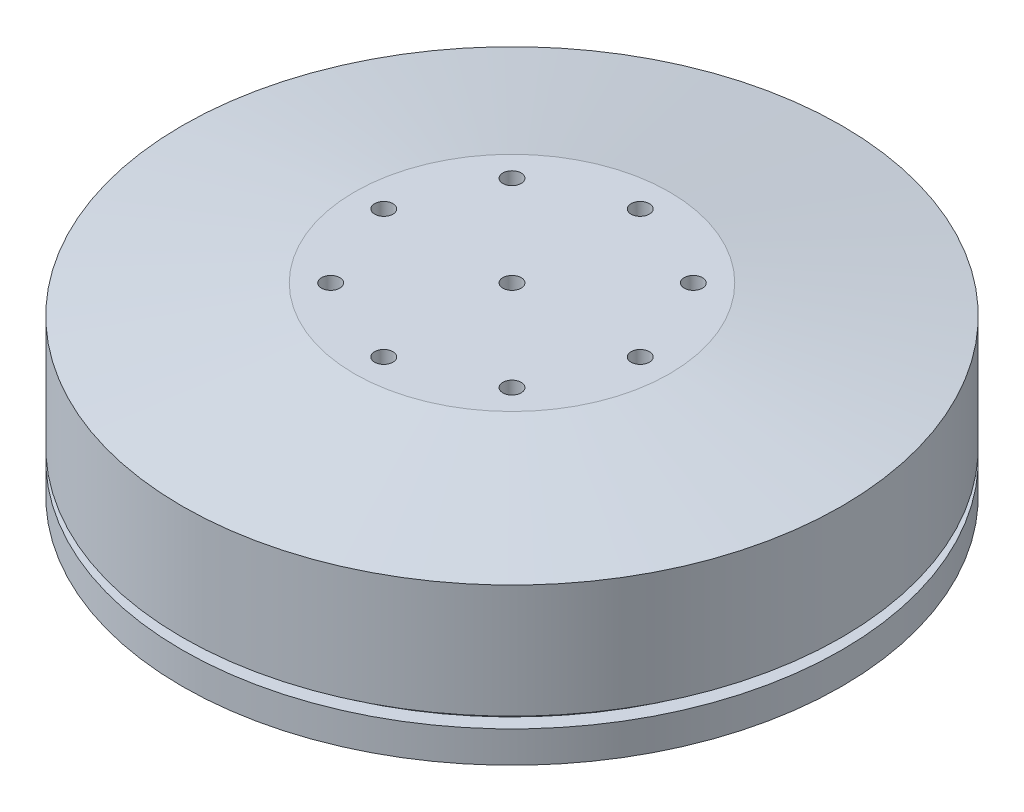
ISO-10303-21;
HEADER;
FILE_DESCRIPTION(('STEP AP214'),'2;1');
FILE_NAME('part.step','',(''),(''),'','','');
FILE_SCHEMA(('AUTOMOTIVE_DESIGN { 1 0 10303 214 1 1 1 1 }'));
ENDSEC;
DATA;
#1=APPLICATION_CONTEXT('core data for automotive mechanical design processes');
#2=APPLICATION_PROTOCOL_DEFINITION('international standard','automotive_design',2000,#1);
#3=PRODUCT_CONTEXT('',#1,'mechanical');
#4=PRODUCT('Part','Part','',(#3));
#5=PRODUCT_RELATED_PRODUCT_CATEGORY('part','',(#4));
#6=PRODUCT_DEFINITION_FORMATION('','',#4);
#7=PRODUCT_DEFINITION_CONTEXT('part definition',#1,'design');
#8=PRODUCT_DEFINITION('design','',#6,#7);
#9=PRODUCT_DEFINITION_SHAPE('','',#8);
#10=(LENGTH_UNIT() NAMED_UNIT(*) SI_UNIT(.MILLI.,.METRE.));
#11=(NAMED_UNIT(*) PLANE_ANGLE_UNIT() SI_UNIT($,.RADIAN.));
#12=(NAMED_UNIT(*) SI_UNIT($,.STERADIAN.) SOLID_ANGLE_UNIT());
#13=UNCERTAINTY_MEASURE_WITH_UNIT(LENGTH_MEASURE(1.E-05),#10,'distance_accuracy_value','');
#14=(GEOMETRIC_REPRESENTATION_CONTEXT(3) GLOBAL_UNCERTAINTY_ASSIGNED_CONTEXT((#13)) GLOBAL_UNIT_ASSIGNED_CONTEXT((#10,
#11,#12)) REPRESENTATION_CONTEXT('',''));
#15=CARTESIAN_POINT('',(0.,0.,0.));
#16=DIRECTION('',(0.,0.,1.));
#17=DIRECTION('',(1.,0.,0.));
#18=AXIS2_PLACEMENT_3D('',#15,#16,#17);
#19=CARTESIAN_POINT('',(-26.5,0.,0.));
#20=DIRECTION('',(0.,-1.,0.));
#21=DIRECTION('',(0.,0.,-1.));
#22=AXIS2_PLACEMENT_3D('',#19,#20,#21);
#23=PLANE('',#22);
#24=CARTESIAN_POINT('',(0.,0.,-15.));
#25=DIRECTION('',(0.,-1.,0.));
#26=DIRECTION('',(0.,0.,-1.));
#27=AXIS2_PLACEMENT_3D('',#24,#25,#26);
#28=CIRCLE('',#27,1.24999999999999);
#29=CARTESIAN_POINT('',(0.,0.,-16.25));
#30=VERTEX_POINT('',#29);
#31=EDGE_CURVE('E95',#30,#30,#28,.T.);
#32=ORIENTED_EDGE('',*,*,#31,.F.);
#33=EDGE_LOOP('',(#32));
#34=FACE_BOUND('',#33,.T.);
#35=CARTESIAN_POINT('',(-15.0000000000004,0.,-4.24488671257339E-13));
#36=DIRECTION('',(0.,-1.,0.));
#37=DIRECTION('',(0.,0.,-1.));
#38=AXIS2_PLACEMENT_3D('',#35,#36,#37);
#39=CIRCLE('',#38,1.24999999999999);
#40=CARTESIAN_POINT('',(-15.0000000000004,0.,-1.25000000000041));
#41=VERTEX_POINT('',#40);
#42=EDGE_CURVE('E94',#41,#41,#39,.T.);
#43=ORIENTED_EDGE('',*,*,#42,.F.);
#44=EDGE_LOOP('',(#43));
#45=FACE_BOUND('',#44,.T.);
#46=CARTESIAN_POINT('',(-8.48977342514678E-13,0.,15.));
#47=DIRECTION('',(0.,-1.,0.));
#48=DIRECTION('',(0.,0.,-1.));
#49=AXIS2_PLACEMENT_3D('',#46,#47,#48);
#50=CIRCLE('',#49,1.24999999999999);
#51=CARTESIAN_POINT('',(-8.48977342514678E-13,0.,13.75));
#52=VERTEX_POINT('',#51);
#53=EDGE_CURVE('E105',#52,#52,#50,.T.);
#54=ORIENTED_EDGE('',*,*,#53,.F.);
#55=EDGE_LOOP('',(#54));
#56=FACE_BOUND('',#55,.T.);
#57=CARTESIAN_POINT('',(14.9999999999996,0.,4.22651701058618E-13));
#58=DIRECTION('',(0.,-1.,0.));
#59=DIRECTION('',(0.,0.,-1.));
#60=AXIS2_PLACEMENT_3D('',#57,#58,#59);
#61=CIRCLE('',#60,1.24999999999999);
#62=CARTESIAN_POINT('',(14.9999999999996,0.,-1.24999999999956));
#63=VERTEX_POINT('',#62);
#64=EDGE_CURVE('E111',#63,#63,#61,.T.);
#65=ORIENTED_EDGE('',*,*,#64,.F.);
#66=EDGE_LOOP('',(#65));
#67=FACE_BOUND('',#66,.T.);
#68=CARTESIAN_POINT('',(-4.23570186157979E-13,0.,0.));
#69=DIRECTION('',(0.,-1.,0.));
#70=DIRECTION('',(0.,0.,-1.));
#71=AXIS2_PLACEMENT_3D('',#68,#69,#70);
#72=CIRCLE('',#71,1.25000000000041);
#73=CARTESIAN_POINT('',(-4.23570186157979E-13,0.,-1.25000000000041));
#74=VERTEX_POINT('',#73);
#75=EDGE_CURVE('E117',#74,#74,#72,.T.);
#76=ORIENTED_EDGE('',*,*,#75,.F.);
#77=EDGE_LOOP('',(#76));
#78=FACE_BOUND('',#77,.T.);
#79=CARTESIAN_POINT('',(0.,0.,0.));
#80=DIRECTION('',(0.,1.,0.));
#81=DIRECTION('',(0.,0.,1.));
#82=AXIS2_PLACEMENT_3D('',#79,#80,#81);
#83=CIRCLE('',#82,26.5);
#84=CARTESIAN_POINT('',(0.,0.,26.5));
#85=VERTEX_POINT('',#84);
#86=EDGE_CURVE('E177',#85,#85,#83,.T.);
#87=ORIENTED_EDGE('',*,*,#86,.F.);
#88=EDGE_LOOP('',(#87));
#89=FACE_BOUND('',#88,.T.);
#90=ADVANCED_FACE('F34',(#34,#45,#56,#67,#78,#89),#23,.T.);
#91=CARTESIAN_POINT('',(0.,33.5,0.));
#92=DIRECTION('',(0.,1.,0.));
#93=DIRECTION('',(0.,0.,1.));
#94=AXIS2_PLACEMENT_3D('',#91,#92,#93);
#95=PLANE('',#94);
#96=CARTESIAN_POINT('',(0.,33.5,-17.5));
#97=DIRECTION('',(0.,1.,0.));
#98=DIRECTION('',(0.,0.,1.));
#99=AXIS2_PLACEMENT_3D('',#96,#97,#98);
#100=CIRCLE('',#99,1.24999999999999);
#101=CARTESIAN_POINT('',(0.,33.5,-16.25));
#102=VERTEX_POINT('',#101);
#103=EDGE_CURVE('E123',#102,#102,#100,.T.);
#104=ORIENTED_EDGE('',*,*,#103,.F.);
#105=EDGE_LOOP('',(#104));
#106=FACE_BOUND('',#105,.T.);
#107=CARTESIAN_POINT('',(12.3743686707648,33.5,-12.374368670765));
#108=DIRECTION('',(0.,1.,0.));
#109=DIRECTION('',(0.,0.,1.));
#110=AXIS2_PLACEMENT_3D('',#107,#108,#109);
#111=CIRCLE('',#110,1.24999999999999);
#112=CARTESIAN_POINT('',(12.3743686707648,33.5,-11.124368670765));
#113=VERTEX_POINT('',#112);
#114=EDGE_CURVE('E129',#113,#113,#111,.T.);
#115=ORIENTED_EDGE('',*,*,#114,.F.);
#116=EDGE_LOOP('',(#115));
#117=FACE_BOUND('',#116,.T.);
#118=CARTESIAN_POINT('',(17.5000000000006,33.5,-6.37804572835263E-13));
#119=DIRECTION('',(0.,1.,0.));
#120=DIRECTION('',(0.,0.,1.));
#121=AXIS2_PLACEMENT_3D('',#118,#119,#120);
#122=CIRCLE('',#121,1.24999999999999);
#123=CARTESIAN_POINT('',(17.5000000000006,33.5,1.24999999999935));
#124=VERTEX_POINT('',#123);
#125=EDGE_CURVE('E135',#124,#124,#122,.T.);
#126=ORIENTED_EDGE('',*,*,#125,.F.);
#127=EDGE_LOOP('',(#126));
#128=FACE_BOUND('',#127,.T.);
#129=CARTESIAN_POINT('',(12.3743686707657,33.5,12.3743686707641));
#130=DIRECTION('',(0.,1.,0.));
#131=DIRECTION('',(0.,0.,1.));
#132=AXIS2_PLACEMENT_3D('',#129,#130,#131);
#133=CIRCLE('',#132,1.24999999999999);
#134=CARTESIAN_POINT('',(12.3743686707657,33.5,13.6243686707641));
#135=VERTEX_POINT('',#134);
#136=EDGE_CURVE('E141',#135,#135,#133,.T.);
#137=ORIENTED_EDGE('',*,*,#136,.F.);
#138=EDGE_LOOP('',(#137));
#139=FACE_BOUND('',#138,.T.);
#140=CARTESIAN_POINT('',(1.27560914567053E-12,33.5,17.5));
#141=DIRECTION('',(0.,1.,0.));
#142=DIRECTION('',(0.,0.,1.));
#143=AXIS2_PLACEMENT_3D('',#140,#141,#142);
#144=CIRCLE('',#143,1.24999999999999);
#145=CARTESIAN_POINT('',(1.27560914567053E-12,33.5,18.75));
#146=VERTEX_POINT('',#145);
#147=EDGE_CURVE('E147',#146,#146,#144,.T.);
#148=ORIENTED_EDGE('',*,*,#147,.F.);
#149=EDGE_LOOP('',(#148));
#150=FACE_BOUND('',#149,.T.);
#151=CARTESIAN_POINT('',(-12.3743686707635,33.5,12.374368670765));
#152=DIRECTION('',(0.,1.,0.));
#153=DIRECTION('',(0.,0.,1.));
#154=AXIS2_PLACEMENT_3D('',#151,#152,#153);
#155=CIRCLE('',#154,1.24999999999999);
#156=CARTESIAN_POINT('',(-12.3743686707635,33.5,13.624368670765));
#157=VERTEX_POINT('',#156);
#158=EDGE_CURVE('E153',#157,#157,#155,.T.);
#159=ORIENTED_EDGE('',*,*,#158,.F.);
#160=EDGE_LOOP('',(#159));
#161=FACE_BOUND('',#160,.T.);
#162=CARTESIAN_POINT('',(-17.4999999999994,33.5,6.3994770473377E-13));
#163=DIRECTION('',(0.,1.,0.));
#164=DIRECTION('',(0.,0.,1.));
#165=AXIS2_PLACEMENT_3D('',#162,#163,#164);
#166=CIRCLE('',#165,1.24999999999999);
#167=CARTESIAN_POINT('',(-17.4999999999994,33.5,1.25000000000063));
#168=VERTEX_POINT('',#167);
#169=EDGE_CURVE('E159',#168,#168,#166,.T.);
#170=ORIENTED_EDGE('',*,*,#169,.F.);
#171=EDGE_LOOP('',(#170));
#172=FACE_BOUND('',#171,.T.);
#173=CARTESIAN_POINT('',(-12.3743686707644,33.5,-12.3743686707641));
#174=DIRECTION('',(0.,1.,0.));
#175=DIRECTION('',(0.,0.,1.));
#176=AXIS2_PLACEMENT_3D('',#173,#174,#175);
#177=CIRCLE('',#176,1.24999999999999);
#178=CARTESIAN_POINT('',(-12.3743686707644,33.5,-11.1243686707641));
#179=VERTEX_POINT('',#178);
#180=EDGE_CURVE('E165',#179,#179,#177,.T.);
#181=ORIENTED_EDGE('',*,*,#180,.F.);
#182=EDGE_LOOP('',(#181));
#183=FACE_BOUND('',#182,.T.);
#184=CARTESIAN_POINT('',(6.36733006886009E-13,33.5,0.));
#185=DIRECTION('',(0.,1.,0.));
#186=DIRECTION('',(0.,0.,1.));
#187=AXIS2_PLACEMENT_3D('',#184,#185,#186);
#188=CIRCLE('',#187,1.24999999999999);
#189=CARTESIAN_POINT('',(6.36733006886009E-13,33.5,1.24999999999999));
#190=VERTEX_POINT('',#189);
#191=EDGE_CURVE('E171',#190,#190,#188,.T.);
#192=ORIENTED_EDGE('',*,*,#191,.F.);
#193=EDGE_LOOP('',(#192));
#194=FACE_BOUND('',#193,.T.);
#195=CARTESIAN_POINT('',(0.,33.5,0.));
#196=DIRECTION('',(0.,1.,0.));
#197=DIRECTION('',(0.,0.,1.));
#198=AXIS2_PLACEMENT_3D('',#195,#196,#197);
#199=CIRCLE('',#198,21.5);
#200=CARTESIAN_POINT('',(0.,33.5,21.5));
#201=VERTEX_POINT('',#200);
#202=EDGE_CURVE('E11',#201,#201,#199,.T.);
#203=ORIENTED_EDGE('',*,*,#202,.T.);
#204=EDGE_LOOP('',(#203));
#205=FACE_BOUND('',#204,.T.);
#206=ADVANCED_FACE('F215',(#106,#117,#128,#139,#150,#161,#172,#183,#194,#205),#95,.T.);
#207=CARTESIAN_POINT('',(0.,33.5,0.));
#208=DIRECTION('',(0.,-1.,0.));
#209=DIRECTION('',(0.,0.,-1.));
#210=AXIS2_PLACEMENT_3D('',#207,#208,#209);
#211=CONICAL_SURFACE('',#210,21.5,1.40633778039562);
#212=CARTESIAN_POINT('',(0.,29.6,0.));
#213=DIRECTION('',(0.,1.,0.));
#214=DIRECTION('',(0.,0.,1.));
#215=AXIS2_PLACEMENT_3D('',#212,#213,#214);
#216=CIRCLE('',#215,45.);
#217=CARTESIAN_POINT('',(0.,29.6,45.));
#218=VERTEX_POINT('',#217);
#219=EDGE_CURVE('E41',#218,#218,#216,.T.);
#220=ORIENTED_EDGE('',*,*,#219,.T.);
#221=EDGE_LOOP('',(#220));
#222=FACE_BOUND('',#221,.T.);
#223=ORIENTED_EDGE('',*,*,#202,.F.);
#224=EDGE_LOOP('',(#223));
#225=FACE_BOUND('',#224,.T.);
#226=ADVANCED_FACE('F200',(#222,#225),#211,.T.);
#227=CARTESIAN_POINT('',(0.,0.,0.));
#228=DIRECTION('',(0.,1.,0.));
#229=DIRECTION('',(0.,0.,1.));
#230=AXIS2_PLACEMENT_3D('',#227,#228,#229);
#231=CYLINDRICAL_SURFACE('',#230,45.);
#232=CARTESIAN_POINT('',(0.,14.1,0.));
#233=DIRECTION('',(0.,1.,0.));
#234=DIRECTION('',(0.,0.,1.));
#235=AXIS2_PLACEMENT_3D('',#232,#233,#234);
#236=CIRCLE('',#235,45.);
#237=CARTESIAN_POINT('',(0.,14.1,45.));
#238=VERTEX_POINT('',#237);
#239=EDGE_CURVE('E195',#238,#238,#236,.T.);
#240=ORIENTED_EDGE('',*,*,#239,.T.);
#241=EDGE_LOOP('',(#240));
#242=FACE_BOUND('',#241,.T.);
#243=ORIENTED_EDGE('',*,*,#219,.F.);
#244=EDGE_LOOP('',(#243));
#245=FACE_BOUND('',#244,.T.);
#246=ADVANCED_FACE('F203',(#242,#245),#231,.T.);
#247=CARTESIAN_POINT('',(-45.,14.1,0.));
#248=DIRECTION('',(0.,-1.,0.));
#249=DIRECTION('',(0.,0.,-1.));
#250=AXIS2_PLACEMENT_3D('',#247,#248,#249);
#251=PLANE('',#250);
#252=CARTESIAN_POINT('',(0.,14.1,0.));
#253=DIRECTION('',(0.,1.,0.));
#254=DIRECTION('',(0.,0.,1.));
#255=AXIS2_PLACEMENT_3D('',#252,#253,#254);
#256=CIRCLE('',#255,43.);
#257=CARTESIAN_POINT('',(0.,14.1,43.));
#258=VERTEX_POINT('',#257);
#259=EDGE_CURVE('E192',#258,#258,#256,.T.);
#260=ORIENTED_EDGE('',*,*,#259,.T.);
#261=EDGE_LOOP('',(#260));
#262=FACE_BOUND('',#261,.T.);
#263=ORIENTED_EDGE('',*,*,#239,.F.);
#264=EDGE_LOOP('',(#263));
#265=FACE_BOUND('',#264,.T.);
#266=ADVANCED_FACE('F205',(#262,#265),#251,.T.);
#267=CARTESIAN_POINT('',(0.,0.,0.));
#268=DIRECTION('',(0.,1.,0.));
#269=DIRECTION('',(0.,0.,1.));
#270=AXIS2_PLACEMENT_3D('',#267,#268,#269);
#271=CYLINDRICAL_SURFACE('',#270,43.);
#272=CARTESIAN_POINT('',(0.,12.6,0.));
#273=DIRECTION('',(0.,1.,0.));
#274=DIRECTION('',(0.,0.,1.));
#275=AXIS2_PLACEMENT_3D('',#272,#273,#274);
#276=CIRCLE('',#275,43.);
#277=CARTESIAN_POINT('',(0.,12.6,43.));
#278=VERTEX_POINT('',#277);
#279=EDGE_CURVE('E189',#278,#278,#276,.T.);
#280=ORIENTED_EDGE('',*,*,#279,.T.);
#281=EDGE_LOOP('',(#280));
#282=FACE_BOUND('',#281,.T.);
#283=ORIENTED_EDGE('',*,*,#259,.F.);
#284=EDGE_LOOP('',(#283));
#285=FACE_BOUND('',#284,.T.);
#286=ADVANCED_FACE('F212',(#282,#285),#271,.T.);
#287=CARTESIAN_POINT('',(-43.,12.6,0.));
#288=DIRECTION('',(0.,1.,0.));
#289=DIRECTION('',(0.,0.,1.));
#290=AXIS2_PLACEMENT_3D('',#287,#288,#289);
#291=PLANE('',#290);
#292=CARTESIAN_POINT('',(0.,12.6,0.));
#293=DIRECTION('',(0.,1.,0.));
#294=DIRECTION('',(0.,0.,1.));
#295=AXIS2_PLACEMENT_3D('',#292,#293,#294);
#296=CIRCLE('',#295,45.);
#297=CARTESIAN_POINT('',(0.,12.6,45.));
#298=VERTEX_POINT('',#297);
#299=EDGE_CURVE('E186',#298,#298,#296,.T.);
#300=ORIENTED_EDGE('',*,*,#299,.T.);
#301=EDGE_LOOP('',(#300));
#302=FACE_BOUND('',#301,.T.);
#303=ORIENTED_EDGE('',*,*,#279,.F.);
#304=EDGE_LOOP('',(#303));
#305=FACE_BOUND('',#304,.T.);
#306=ADVANCED_FACE('F251',(#302,#305),#291,.T.);
#307=CARTESIAN_POINT('',(0.,0.,0.));
#308=DIRECTION('',(0.,1.,0.));
#309=DIRECTION('',(0.,0.,1.));
#310=AXIS2_PLACEMENT_3D('',#307,#308,#309);
#311=CYLINDRICAL_SURFACE('',#310,45.);
#312=CARTESIAN_POINT('',(0.,8.3,0.));
#313=DIRECTION('',(0.,1.,0.));
#314=DIRECTION('',(0.,0.,1.));
#315=AXIS2_PLACEMENT_3D('',#312,#313,#314);
#316=CIRCLE('',#315,45.);
#317=CARTESIAN_POINT('',(0.,8.3,45.));
#318=VERTEX_POINT('',#317);
#319=EDGE_CURVE('E183',#318,#318,#316,.T.);
#320=ORIENTED_EDGE('',*,*,#319,.T.);
#321=EDGE_LOOP('',(#320));
#322=FACE_BOUND('',#321,.T.);
#323=ORIENTED_EDGE('',*,*,#299,.F.);
#324=EDGE_LOOP('',(#323));
#325=FACE_BOUND('',#324,.T.);
#326=ADVANCED_FACE('F245',(#322,#325),#311,.T.);
#327=CARTESIAN_POINT('',(0.,8.3,0.));
#328=DIRECTION('',(0.,1.,0.));
#329=DIRECTION('',(0.,0.,1.));
#330=AXIS2_PLACEMENT_3D('',#327,#328,#329);
#331=CONICAL_SURFACE('',#330,45.,1.42587356281597);
#332=CARTESIAN_POINT('',(0.,5.6,0.));
#333=DIRECTION('',(0.,1.,0.));
#334=DIRECTION('',(0.,0.,1.));
#335=AXIS2_PLACEMENT_3D('',#332,#333,#334);
#336=CIRCLE('',#335,26.5);
#337=CARTESIAN_POINT('',(0.,5.6,26.5));
#338=VERTEX_POINT('',#337);
#339=EDGE_CURVE('E180',#338,#338,#336,.T.);
#340=ORIENTED_EDGE('',*,*,#339,.T.);
#341=EDGE_LOOP('',(#340));
#342=FACE_BOUND('',#341,.T.);
#343=ORIENTED_EDGE('',*,*,#319,.F.);
#344=EDGE_LOOP('',(#343));
#345=FACE_BOUND('',#344,.T.);
#346=ADVANCED_FACE('F239',(#342,#345),#331,.T.);
#347=CARTESIAN_POINT('',(0.,0.,0.));
#348=DIRECTION('',(0.,1.,0.));
#349=DIRECTION('',(0.,0.,1.));
#350=AXIS2_PLACEMENT_3D('',#347,#348,#349);
#351=CYLINDRICAL_SURFACE('',#350,26.5);
#352=ORIENTED_EDGE('',*,*,#86,.T.);
#353=EDGE_LOOP('',(#352));
#354=FACE_BOUND('',#353,.T.);
#355=ORIENTED_EDGE('',*,*,#339,.F.);
#356=EDGE_LOOP('',(#355));
#357=FACE_BOUND('',#356,.T.);
#358=ADVANCED_FACE('F235',(#354,#357),#351,.T.);
#359=CARTESIAN_POINT('',(6.36733006886009E-13,27.5,0.));
#360=DIRECTION('',(0.,1.,0.));
#361=DIRECTION('',(0.,0.,1.));
#362=AXIS2_PLACEMENT_3D('',#359,#360,#361);
#363=CONICAL_SURFACE('',#362,1.25,1.02974425867665);
#364=CARTESIAN_POINT('',(6.35079470218575E-13,26.7489242262156,0.));
#365=VERTEX_POINT('',#364);
#366=VERTEX_LOOP('',#365);
#367=FACE_BOUND('',#366,.T.);
#368=CARTESIAN_POINT('',(6.36733006886009E-13,27.5,0.));
#369=DIRECTION('',(0.,1.,0.));
#370=DIRECTION('',(0.,0.,1.));
#371=AXIS2_PLACEMENT_3D('',#368,#369,#370);
#372=CIRCLE('',#371,1.25);
#373=CARTESIAN_POINT('',(6.36733006886009E-13,27.5,1.25));
#374=VERTEX_POINT('',#373);
#375=EDGE_CURVE('E174',#374,#374,#372,.T.);
#376=ORIENTED_EDGE('',*,*,#375,.T.);
#377=EDGE_LOOP('',(#376));
#378=FACE_BOUND('',#377,.T.);
#379=ADVANCED_FACE('F238',(#367,#378),#363,.F.);
#380=CARTESIAN_POINT('',(6.36733006886009E-13,33.5,0.));
#381=DIRECTION('',(0.,1.,0.));
#382=DIRECTION('',(0.,0.,1.));
#383=AXIS2_PLACEMENT_3D('',#380,#381,#382);
#384=CYLINDRICAL_SURFACE('',#383,1.24999999999999);
#385=ORIENTED_EDGE('',*,*,#375,.F.);
#386=EDGE_LOOP('',(#385));
#387=FACE_BOUND('',#386,.T.);
#388=ORIENTED_EDGE('',*,*,#191,.T.);
#389=EDGE_LOOP('',(#388));
#390=FACE_BOUND('',#389,.T.);
#391=ADVANCED_FACE('F271',(#387,#390),#384,.F.);
#392=CARTESIAN_POINT('',(-12.3743686707644,27.5,-12.3743686707641));
#393=DIRECTION('',(0.,1.,0.));
#394=DIRECTION('',(0.,0.,1.));
#395=AXIS2_PLACEMENT_3D('',#392,#393,#394);
#396=CONICAL_SURFACE('',#395,1.25,1.02974425867665);
#397=CARTESIAN_POINT('',(-12.3743686707644,26.7489242262156,-12.3743686707641));
#398=VERTEX_POINT('',#397);
#399=VERTEX_LOOP('',#398);
#400=FACE_BOUND('',#399,.T.);
#401=CARTESIAN_POINT('',(-12.3743686707644,27.5,-12.3743686707641));
#402=DIRECTION('',(0.,1.,0.));
#403=DIRECTION('',(0.,0.,1.));
#404=AXIS2_PLACEMENT_3D('',#401,#402,#403);
#405=CIRCLE('',#404,1.25);
#406=CARTESIAN_POINT('',(-12.3743686707644,27.5,-11.1243686707641));
#407=VERTEX_POINT('',#406);
#408=EDGE_CURVE('E168',#407,#407,#405,.T.);
#409=ORIENTED_EDGE('',*,*,#408,.T.);
#410=EDGE_LOOP('',(#409));
#411=FACE_BOUND('',#410,.T.);
#412=ADVANCED_FACE('F274',(#400,#411),#396,.F.);
#413=CARTESIAN_POINT('',(-12.3743686707644,33.5,-12.3743686707641));
#414=DIRECTION('',(0.,1.,0.));
#415=DIRECTION('',(0.,0.,1.));
#416=AXIS2_PLACEMENT_3D('',#413,#414,#415);
#417=CYLINDRICAL_SURFACE('',#416,1.24999999999999);
#418=ORIENTED_EDGE('',*,*,#408,.F.);
#419=EDGE_LOOP('',(#418));
#420=FACE_BOUND('',#419,.T.);
#421=ORIENTED_EDGE('',*,*,#180,.T.);
#422=EDGE_LOOP('',(#421));
#423=FACE_BOUND('',#422,.T.);
#424=ADVANCED_FACE('F278',(#420,#423),#417,.F.);
#425=CARTESIAN_POINT('',(-17.4999999999994,27.5,6.3994770473377E-13));
#426=DIRECTION('',(0.,1.,0.));
#427=DIRECTION('',(0.,0.,1.));
#428=AXIS2_PLACEMENT_3D('',#425,#426,#427);
#429=CONICAL_SURFACE('',#428,1.25,1.02974425867665);
#430=CARTESIAN_POINT('',(-17.4999999999994,26.7489242262156,6.3994770473377E-13));
#431=VERTEX_POINT('',#430);
#432=VERTEX_LOOP('',#431);
#433=FACE_BOUND('',#432,.T.);
#434=CARTESIAN_POINT('',(-17.4999999999994,27.5,6.3994770473377E-13));
#435=DIRECTION('',(0.,1.,0.));
#436=DIRECTION('',(0.,0.,1.));
#437=AXIS2_PLACEMENT_3D('',#434,#435,#436);
#438=CIRCLE('',#437,1.25);
#439=CARTESIAN_POINT('',(-17.4999999999994,27.5,1.25000000000064));
#440=VERTEX_POINT('',#439);
#441=EDGE_CURVE('E162',#440,#440,#438,.T.);
#442=ORIENTED_EDGE('',*,*,#441,.T.);
#443=EDGE_LOOP('',(#442));
#444=FACE_BOUND('',#443,.T.);
#445=ADVANCED_FACE('F281',(#433,#444),#429,.F.);
#446=CARTESIAN_POINT('',(-17.4999999999994,33.5,6.3994770473377E-13));
#447=DIRECTION('',(0.,1.,0.));
#448=DIRECTION('',(0.,0.,1.));
#449=AXIS2_PLACEMENT_3D('',#446,#447,#448);
#450=CYLINDRICAL_SURFACE('',#449,1.24999999999999);
#451=ORIENTED_EDGE('',*,*,#441,.F.);
#452=EDGE_LOOP('',(#451));
#453=FACE_BOUND('',#452,.T.);
#454=ORIENTED_EDGE('',*,*,#169,.T.);
#455=EDGE_LOOP('',(#454));
#456=FACE_BOUND('',#455,.T.);
#457=ADVANCED_FACE('F285',(#453,#456),#450,.F.);
#458=CARTESIAN_POINT('',(-12.3743686707635,27.5,12.374368670765));
#459=DIRECTION('',(0.,1.,0.));
#460=DIRECTION('',(0.,0.,1.));
#461=AXIS2_PLACEMENT_3D('',#458,#459,#460);
#462=CONICAL_SURFACE('',#461,1.25,1.02974425867665);
#463=CARTESIAN_POINT('',(-12.3743686707635,26.7489242262156,12.374368670765));
#464=VERTEX_POINT('',#463);
#465=VERTEX_LOOP('',#464);
#466=FACE_BOUND('',#465,.T.);
#467=CARTESIAN_POINT('',(-12.3743686707635,27.5,12.374368670765));
#468=DIRECTION('',(0.,1.,0.));
#469=DIRECTION('',(0.,0.,1.));
#470=AXIS2_PLACEMENT_3D('',#467,#468,#469);
#471=CIRCLE('',#470,1.25);
#472=CARTESIAN_POINT('',(-12.3743686707635,27.5,13.624368670765));
#473=VERTEX_POINT('',#472);
#474=EDGE_CURVE('E156',#473,#473,#471,.T.);
#475=ORIENTED_EDGE('',*,*,#474,.T.);
#476=EDGE_LOOP('',(#475));
#477=FACE_BOUND('',#476,.T.);
#478=ADVANCED_FACE('F289',(#466,#477),#462,.F.);
#479=CARTESIAN_POINT('',(-12.3743686707635,33.5,12.374368670765));
#480=DIRECTION('',(0.,1.,0.));
#481=DIRECTION('',(0.,0.,1.));
#482=AXIS2_PLACEMENT_3D('',#479,#480,#481);
#483=CYLINDRICAL_SURFACE('',#482,1.24999999999999);
#484=ORIENTED_EDGE('',*,*,#474,.F.);
#485=EDGE_LOOP('',(#484));
#486=FACE_BOUND('',#485,.T.);
#487=ORIENTED_EDGE('',*,*,#158,.T.);
#488=EDGE_LOOP('',(#487));
#489=FACE_BOUND('',#488,.T.);
#490=ADVANCED_FACE('F293',(#486,#489),#483,.F.);
#491=CARTESIAN_POINT('',(1.27560914567053E-12,27.5,17.5));
#492=DIRECTION('',(0.,1.,0.));
#493=DIRECTION('',(0.,0.,1.));
#494=AXIS2_PLACEMENT_3D('',#491,#492,#493);
#495=CONICAL_SURFACE('',#494,1.25,1.02974425867665);
#496=CARTESIAN_POINT('',(1.27395560900309E-12,26.7489242262156,17.5));
#497=VERTEX_POINT('',#496);
#498=VERTEX_LOOP('',#497);
#499=FACE_BOUND('',#498,.T.);
#500=CARTESIAN_POINT('',(1.27560914567053E-12,27.5,17.5));
#501=DIRECTION('',(0.,1.,0.));
#502=DIRECTION('',(0.,0.,1.));
#503=AXIS2_PLACEMENT_3D('',#500,#501,#502);
#504=CIRCLE('',#503,1.25);
#505=CARTESIAN_POINT('',(1.27560914567053E-12,27.5,18.75));
#506=VERTEX_POINT('',#505);
#507=EDGE_CURVE('E150',#506,#506,#504,.T.);
#508=ORIENTED_EDGE('',*,*,#507,.T.);
#509=EDGE_LOOP('',(#508));
#510=FACE_BOUND('',#509,.T.);
#511=ADVANCED_FACE('F297',(#499,#510),#495,.F.);
#512=CARTESIAN_POINT('',(1.27560914567053E-12,33.5,17.5));
#513=DIRECTION('',(0.,1.,0.));
#514=DIRECTION('',(0.,0.,1.));
#515=AXIS2_PLACEMENT_3D('',#512,#513,#514);
#516=CYLINDRICAL_SURFACE('',#515,1.24999999999999);
#517=ORIENTED_EDGE('',*,*,#507,.F.);
#518=EDGE_LOOP('',(#517));
#519=FACE_BOUND('',#518,.T.);
#520=ORIENTED_EDGE('',*,*,#147,.T.);
#521=EDGE_LOOP('',(#520));
#522=FACE_BOUND('',#521,.T.);
#523=ADVANCED_FACE('F301',(#519,#522),#516,.F.);
#524=CARTESIAN_POINT('',(12.3743686707657,27.5,12.3743686707641));
#525=DIRECTION('',(0.,1.,0.));
#526=DIRECTION('',(0.,0.,1.));
#527=AXIS2_PLACEMENT_3D('',#524,#525,#526);
#528=CONICAL_SURFACE('',#527,1.25,1.02974425867665);
#529=CARTESIAN_POINT('',(12.3743686707657,26.7489242262156,12.3743686707641));
#530=VERTEX_POINT('',#529);
#531=VERTEX_LOOP('',#530);
#532=FACE_BOUND('',#531,.T.);
#533=CARTESIAN_POINT('',(12.3743686707657,27.5,12.3743686707641));
#534=DIRECTION('',(0.,1.,0.));
#535=DIRECTION('',(0.,0.,1.));
#536=AXIS2_PLACEMENT_3D('',#533,#534,#535);
#537=CIRCLE('',#536,1.25);
#538=CARTESIAN_POINT('',(12.3743686707657,27.5,13.6243686707641));
#539=VERTEX_POINT('',#538);
#540=EDGE_CURVE('E144',#539,#539,#537,.T.);
#541=ORIENTED_EDGE('',*,*,#540,.T.);
#542=EDGE_LOOP('',(#541));
#543=FACE_BOUND('',#542,.T.);
#544=ADVANCED_FACE('F305',(#532,#543),#528,.F.);
#545=CARTESIAN_POINT('',(12.3743686707657,33.5,12.3743686707641));
#546=DIRECTION('',(0.,1.,0.));
#547=DIRECTION('',(0.,0.,1.));
#548=AXIS2_PLACEMENT_3D('',#545,#546,#547);
#549=CYLINDRICAL_SURFACE('',#548,1.24999999999999);
#550=ORIENTED_EDGE('',*,*,#540,.F.);
#551=EDGE_LOOP('',(#550));
#552=FACE_BOUND('',#551,.T.);
#553=ORIENTED_EDGE('',*,*,#136,.T.);
#554=EDGE_LOOP('',(#553));
#555=FACE_BOUND('',#554,.T.);
#556=ADVANCED_FACE('F309',(#552,#555),#549,.F.);
#557=CARTESIAN_POINT('',(17.5000000000006,27.5,-6.37804572835263E-13));
#558=DIRECTION('',(0.,1.,0.));
#559=DIRECTION('',(0.,0.,1.));
#560=AXIS2_PLACEMENT_3D('',#557,#558,#559);
#561=CONICAL_SURFACE('',#560,1.25,1.02974425867665);
#562=CARTESIAN_POINT('',(17.5000000000006,26.7489242262156,-6.37804572835263E-13));
#563=VERTEX_POINT('',#562);
#564=VERTEX_LOOP('',#563);
#565=FACE_BOUND('',#564,.T.);
#566=CARTESIAN_POINT('',(17.5000000000006,27.5,-6.37804572835263E-13));
#567=DIRECTION('',(0.,1.,0.));
#568=DIRECTION('',(0.,0.,1.));
#569=AXIS2_PLACEMENT_3D('',#566,#567,#568);
#570=CIRCLE('',#569,1.25);
#571=CARTESIAN_POINT('',(17.5000000000006,27.5,1.24999999999936));
#572=VERTEX_POINT('',#571);
#573=EDGE_CURVE('E138',#572,#572,#570,.T.);
#574=ORIENTED_EDGE('',*,*,#573,.T.);
#575=EDGE_LOOP('',(#574));
#576=FACE_BOUND('',#575,.T.);
#577=ADVANCED_FACE('F313',(#565,#576),#561,.F.);
#578=CARTESIAN_POINT('',(17.5000000000006,33.5,-6.37804572835263E-13));
#579=DIRECTION('',(0.,1.,0.));
#580=DIRECTION('',(0.,0.,1.));
#581=AXIS2_PLACEMENT_3D('',#578,#579,#580);
#582=CYLINDRICAL_SURFACE('',#581,1.24999999999999);
#583=ORIENTED_EDGE('',*,*,#573,.F.);
#584=EDGE_LOOP('',(#583));
#585=FACE_BOUND('',#584,.T.);
#586=ORIENTED_EDGE('',*,*,#125,.T.);
#587=EDGE_LOOP('',(#586));
#588=FACE_BOUND('',#587,.T.);
#589=ADVANCED_FACE('F317',(#585,#588),#582,.F.);
#590=CARTESIAN_POINT('',(12.3743686707648,27.5,-12.374368670765));
#591=DIRECTION('',(0.,1.,0.));
#592=DIRECTION('',(0.,0.,1.));
#593=AXIS2_PLACEMENT_3D('',#590,#591,#592);
#594=CONICAL_SURFACE('',#593,1.25,1.02974425867665);
#595=CARTESIAN_POINT('',(12.3743686707648,26.7489242262156,-12.374368670765));
#596=VERTEX_POINT('',#595);
#597=VERTEX_LOOP('',#596);
#598=FACE_BOUND('',#597,.T.);
#599=CARTESIAN_POINT('',(12.3743686707648,27.5,-12.374368670765));
#600=DIRECTION('',(0.,1.,0.));
#601=DIRECTION('',(0.,0.,1.));
#602=AXIS2_PLACEMENT_3D('',#599,#600,#601);
#603=CIRCLE('',#602,1.25);
#604=CARTESIAN_POINT('',(12.3743686707648,27.5,-11.124368670765));
#605=VERTEX_POINT('',#604);
#606=EDGE_CURVE('E132',#605,#605,#603,.T.);
#607=ORIENTED_EDGE('',*,*,#606,.T.);
#608=EDGE_LOOP('',(#607));
#609=FACE_BOUND('',#608,.T.);
#610=ADVANCED_FACE('F321',(#598,#609),#594,.F.);
#611=CARTESIAN_POINT('',(12.3743686707648,33.5,-12.374368670765));
#612=DIRECTION('',(0.,1.,0.));
#613=DIRECTION('',(0.,0.,1.));
#614=AXIS2_PLACEMENT_3D('',#611,#612,#613);
#615=CYLINDRICAL_SURFACE('',#614,1.24999999999999);
#616=ORIENTED_EDGE('',*,*,#606,.F.);
#617=EDGE_LOOP('',(#616));
#618=FACE_BOUND('',#617,.T.);
#619=ORIENTED_EDGE('',*,*,#114,.T.);
#620=EDGE_LOOP('',(#619));
#621=FACE_BOUND('',#620,.T.);
#622=ADVANCED_FACE('F325',(#618,#621),#615,.F.);
#623=CARTESIAN_POINT('',(0.,27.5,-17.5));
#624=DIRECTION('',(0.,1.,0.));
#625=DIRECTION('',(0.,0.,1.));
#626=AXIS2_PLACEMENT_3D('',#623,#624,#625);
#627=CONICAL_SURFACE('',#626,1.25,1.02974425867665);
#628=CARTESIAN_POINT('',(0.,26.7489242262156,-17.5));
#629=VERTEX_POINT('',#628);
#630=VERTEX_LOOP('',#629);
#631=FACE_BOUND('',#630,.T.);
#632=CARTESIAN_POINT('',(0.,27.5,-17.5));
#633=DIRECTION('',(0.,1.,0.));
#634=DIRECTION('',(0.,0.,1.));
#635=AXIS2_PLACEMENT_3D('',#632,#633,#634);
#636=CIRCLE('',#635,1.25);
#637=CARTESIAN_POINT('',(0.,27.5,-16.25));
#638=VERTEX_POINT('',#637);
#639=EDGE_CURVE('E126',#638,#638,#636,.T.);
#640=ORIENTED_EDGE('',*,*,#639,.T.);
#641=EDGE_LOOP('',(#640));
#642=FACE_BOUND('',#641,.T.);
#643=ADVANCED_FACE('F329',(#631,#642),#627,.F.);
#644=CARTESIAN_POINT('',(0.,33.5,-17.5));
#645=DIRECTION('',(0.,1.,0.));
#646=DIRECTION('',(0.,0.,1.));
#647=AXIS2_PLACEMENT_3D('',#644,#645,#646);
#648=CYLINDRICAL_SURFACE('',#647,1.24999999999999);
#649=ORIENTED_EDGE('',*,*,#639,.F.);
#650=EDGE_LOOP('',(#649));
#651=FACE_BOUND('',#650,.T.);
#652=ORIENTED_EDGE('',*,*,#103,.T.);
#653=EDGE_LOOP('',(#652));
#654=FACE_BOUND('',#653,.T.);
#655=ADVANCED_FACE('F333',(#651,#654),#648,.F.);
#656=CARTESIAN_POINT('',(-4.23570186157979E-13,6.00000000000001,0.));
#657=DIRECTION('',(0.,-1.,0.));
#658=DIRECTION('',(0.,0.,-1.));
#659=AXIS2_PLACEMENT_3D('',#656,#657,#658);
#660=CONICAL_SURFACE('',#659,1.25000000000041,1.02974425867666);
#661=CARTESIAN_POINT('',(0.,6.75107577378445,0.));
#662=VERTEX_POINT('',#661);
#663=VERTEX_LOOP('',#662);
#664=FACE_BOUND('',#663,.T.);
#665=CARTESIAN_POINT('',(-4.23570186157979E-13,6.00000000000001,0.));
#666=DIRECTION('',(0.,-1.,0.));
#667=DIRECTION('',(0.,0.,-1.));
#668=AXIS2_PLACEMENT_3D('',#665,#666,#667);
#669=CIRCLE('',#668,1.25000000000041);
#670=CARTESIAN_POINT('',(-4.23570186157979E-13,6.00000000000001,-1.25000000000041));
#671=VERTEX_POINT('',#670);
#672=EDGE_CURVE('E120',#671,#671,#669,.T.);
#673=ORIENTED_EDGE('',*,*,#672,.T.);
#674=EDGE_LOOP('',(#673));
#675=FACE_BOUND('',#674,.T.);
#676=ADVANCED_FACE('F337',(#664,#675),#660,.F.);
#677=CARTESIAN_POINT('',(-4.23570186157979E-13,0.,0.));
#678=DIRECTION('',(0.,-1.,0.));
#679=DIRECTION('',(0.,0.,-1.));
#680=AXIS2_PLACEMENT_3D('',#677,#678,#679);
#681=CYLINDRICAL_SURFACE('',#680,1.25000000000041);
#682=ORIENTED_EDGE('',*,*,#672,.F.);
#683=EDGE_LOOP('',(#682));
#684=FACE_BOUND('',#683,.T.);
#685=ORIENTED_EDGE('',*,*,#75,.T.);
#686=EDGE_LOOP('',(#685));
#687=FACE_BOUND('',#686,.T.);
#688=ADVANCED_FACE('F341',(#684,#687),#681,.F.);
#689=CARTESIAN_POINT('',(14.9999999999996,6.00000000000001,4.22651701058618E-13));
#690=DIRECTION('',(0.,-1.,0.));
#691=DIRECTION('',(0.,0.,-1.));
#692=AXIS2_PLACEMENT_3D('',#689,#690,#691);
#693=CONICAL_SURFACE('',#692,1.24999999999999,1.02974425867665);
#694=CARTESIAN_POINT('',(14.9999999999996,6.75107577378445,4.22651701058618E-13));
#695=VERTEX_POINT('',#694);
#696=VERTEX_LOOP('',#695);
#697=FACE_BOUND('',#696,.T.);
#698=CARTESIAN_POINT('',(14.9999999999996,6.00000000000001,4.22651701058618E-13));
#699=DIRECTION('',(0.,-1.,0.));
#700=DIRECTION('',(0.,0.,-1.));
#701=AXIS2_PLACEMENT_3D('',#698,#699,#700);
#702=CIRCLE('',#701,1.24999999999999);
#703=CARTESIAN_POINT('',(14.9999999999996,6.00000000000001,-1.24999999999956));
#704=VERTEX_POINT('',#703);
#705=EDGE_CURVE('E114',#704,#704,#702,.T.);
#706=ORIENTED_EDGE('',*,*,#705,.T.);
#707=EDGE_LOOP('',(#706));
#708=FACE_BOUND('',#707,.T.);
#709=ADVANCED_FACE('F345',(#697,#708),#693,.F.);
#710=CARTESIAN_POINT('',(14.9999999999996,0.,4.22651701058618E-13));
#711=DIRECTION('',(0.,-1.,0.));
#712=DIRECTION('',(0.,0.,-1.));
#713=AXIS2_PLACEMENT_3D('',#710,#711,#712);
#714=CYLINDRICAL_SURFACE('',#713,1.24999999999999);
#715=ORIENTED_EDGE('',*,*,#705,.F.);
#716=EDGE_LOOP('',(#715));
#717=FACE_BOUND('',#716,.T.);
#718=ORIENTED_EDGE('',*,*,#64,.T.);
#719=EDGE_LOOP('',(#718));
#720=FACE_BOUND('',#719,.T.);
#721=ADVANCED_FACE('F349',(#717,#720),#714,.F.);
#722=CARTESIAN_POINT('',(-8.48977342514678E-13,6.00000000000001,15.));
#723=DIRECTION('',(0.,-1.,0.));
#724=DIRECTION('',(0.,0.,-1.));
#725=AXIS2_PLACEMENT_3D('',#722,#723,#724);
#726=CONICAL_SURFACE('',#725,1.24999999999999,1.02974425867665);
#727=CARTESIAN_POINT('',(-8.52107202505733E-13,6.75107577378445,15.));
#728=VERTEX_POINT('',#727);
#729=VERTEX_LOOP('',#728);
#730=FACE_BOUND('',#729,.T.);
#731=CARTESIAN_POINT('',(-8.48977342514678E-13,6.00000000000001,15.));
#732=DIRECTION('',(0.,-1.,0.));
#733=DIRECTION('',(0.,0.,-1.));
#734=AXIS2_PLACEMENT_3D('',#731,#732,#733);
#735=CIRCLE('',#734,1.24999999999999);
#736=CARTESIAN_POINT('',(-8.48977342514678E-13,6.00000000000001,13.75));
#737=VERTEX_POINT('',#736);
#738=EDGE_CURVE('E108',#737,#737,#735,.T.);
#739=ORIENTED_EDGE('',*,*,#738,.T.);
#740=EDGE_LOOP('',(#739));
#741=FACE_BOUND('',#740,.T.);
#742=ADVANCED_FACE('F353',(#730,#741),#726,.F.);
#743=CARTESIAN_POINT('',(-8.48977342514678E-13,0.,15.));
#744=DIRECTION('',(0.,-1.,0.));
#745=DIRECTION('',(0.,0.,-1.));
#746=AXIS2_PLACEMENT_3D('',#743,#744,#745);
#747=CYLINDRICAL_SURFACE('',#746,1.24999999999999);
#748=ORIENTED_EDGE('',*,*,#738,.F.);
#749=EDGE_LOOP('',(#748));
#750=FACE_BOUND('',#749,.T.);
#751=ORIENTED_EDGE('',*,*,#53,.T.);
#752=EDGE_LOOP('',(#751));
#753=FACE_BOUND('',#752,.T.);
#754=ADVANCED_FACE('F357',(#750,#753),#747,.F.);
#755=CARTESIAN_POINT('',(-15.0000000000004,6.00000000000001,-4.24488671257339E-13));
#756=DIRECTION('',(0.,-1.,0.));
#757=DIRECTION('',(0.,0.,-1.));
#758=AXIS2_PLACEMENT_3D('',#755,#756,#757);
#759=CONICAL_SURFACE('',#758,1.24999999999999,1.02974425867665);
#760=CARTESIAN_POINT('',(-15.0000000000004,6.75107577378445,-4.24488671257339E-13));
#761=VERTEX_POINT('',#760);
#762=VERTEX_LOOP('',#761);
#763=FACE_BOUND('',#762,.T.);
#764=CARTESIAN_POINT('',(-15.0000000000004,6.00000000000001,-4.24488671257339E-13));
#765=DIRECTION('',(0.,-1.,0.));
#766=DIRECTION('',(0.,0.,-1.));
#767=AXIS2_PLACEMENT_3D('',#764,#765,#766);
#768=CIRCLE('',#767,1.24999999999999);
#769=CARTESIAN_POINT('',(-15.0000000000004,6.00000000000001,-1.25000000000041));
#770=VERTEX_POINT('',#769);
#771=EDGE_CURVE('E98',#770,#770,#768,.T.);
#772=ORIENTED_EDGE('',*,*,#771,.T.);
#773=EDGE_LOOP('',(#772));
#774=FACE_BOUND('',#773,.T.);
#775=ADVANCED_FACE('F361',(#763,#774),#759,.F.);
#776=CARTESIAN_POINT('',(-15.0000000000004,0.,-4.24488671257339E-13));
#777=DIRECTION('',(0.,-1.,0.));
#778=DIRECTION('',(0.,0.,-1.));
#779=AXIS2_PLACEMENT_3D('',#776,#777,#778);
#780=CYLINDRICAL_SURFACE('',#779,1.24999999999999);
#781=ORIENTED_EDGE('',*,*,#771,.F.);
#782=EDGE_LOOP('',(#781));
#783=FACE_BOUND('',#782,.T.);
#784=ORIENTED_EDGE('',*,*,#42,.T.);
#785=EDGE_LOOP('',(#784));
#786=FACE_BOUND('',#785,.T.);
#787=ADVANCED_FACE('F88',(#783,#786),#780,.F.);
#788=CARTESIAN_POINT('',(0.,6.00000000000001,-15.));
#789=DIRECTION('',(0.,-1.,0.));
#790=DIRECTION('',(0.,0.,-1.));
#791=AXIS2_PLACEMENT_3D('',#788,#789,#790);
#792=CONICAL_SURFACE('',#791,1.24999999999999,1.02974425867665);
#793=CARTESIAN_POINT('',(0.,6.75107577378445,-15.));
#794=VERTEX_POINT('',#793);
#795=VERTEX_LOOP('',#794);
#796=FACE_BOUND('',#795,.T.);
#797=CARTESIAN_POINT('',(0.,6.00000000000001,-15.));
#798=DIRECTION('',(0.,-1.,0.));
#799=DIRECTION('',(0.,0.,-1.));
#800=AXIS2_PLACEMENT_3D('',#797,#798,#799);
#801=CIRCLE('',#800,1.24999999999999);
#802=CARTESIAN_POINT('',(0.,6.00000000000001,-16.25));
#803=VERTEX_POINT('',#802);
#804=EDGE_CURVE('E92',#803,#803,#801,.T.);
#805=ORIENTED_EDGE('',*,*,#804,.T.);
#806=EDGE_LOOP('',(#805));
#807=FACE_BOUND('',#806,.T.);
#808=ADVANCED_FACE('F84',(#796,#807),#792,.F.);
#809=CARTESIAN_POINT('',(0.,0.,-15.));
#810=DIRECTION('',(0.,-1.,0.));
#811=DIRECTION('',(0.,0.,-1.));
#812=AXIS2_PLACEMENT_3D('',#809,#810,#811);
#813=CYLINDRICAL_SURFACE('',#812,1.24999999999999);
#814=ORIENTED_EDGE('',*,*,#804,.F.);
#815=EDGE_LOOP('',(#814));
#816=FACE_BOUND('',#815,.T.);
#817=ORIENTED_EDGE('',*,*,#31,.T.);
#818=EDGE_LOOP('',(#817));
#819=FACE_BOUND('',#818,.T.);
#820=ADVANCED_FACE('F87',(#816,#819),#813,.F.);
#821=CLOSED_SHELL('',(#90,#206,#226,#246,#266,#286,#306,#326,#346,#358,#379,#391,#412,#424,#445,
#457,#478,#490,#511,#523,#544,#556,#577,#589,#610,#622,#643,#655,#676,#688,#709,#721,#742,#754,
#775,#787,#808,#820));
#822=MANIFOLD_SOLID_BREP('B2',#821);
#823=ADVANCED_BREP_SHAPE_REPRESENTATION('',(#18,#822),#14);
#824=SHAPE_DEFINITION_REPRESENTATION(#9,#823);
ENDSEC;
END-ISO-10303-21;
